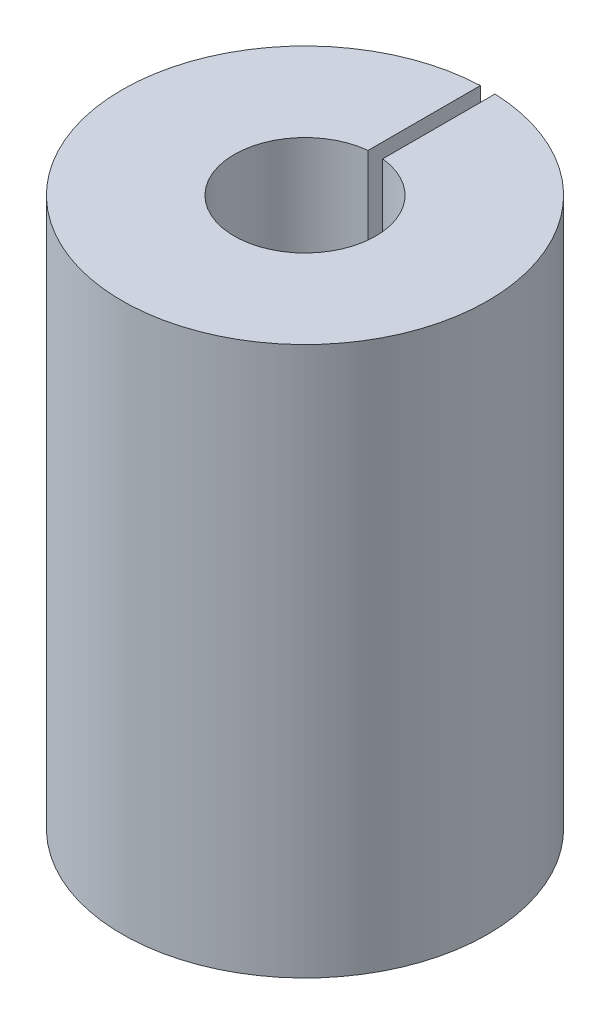
ISO-10303-21;
HEADER;
FILE_DESCRIPTION(('STEP AP214'),'2;1');
FILE_NAME('part.step','',(''),(''),'','','');
FILE_SCHEMA(('AUTOMOTIVE_DESIGN { 1 0 10303 214 1 1 1 1 }'));
ENDSEC;
DATA;
#1=APPLICATION_CONTEXT('core data for automotive mechanical design processes');
#2=APPLICATION_PROTOCOL_DEFINITION('international standard','automotive_design',2000,#1);
#3=PRODUCT_CONTEXT('',#1,'mechanical');
#4=PRODUCT('Part','Part','',(#3));
#5=PRODUCT_RELATED_PRODUCT_CATEGORY('part','',(#4));
#6=PRODUCT_DEFINITION_FORMATION('','',#4);
#7=PRODUCT_DEFINITION_CONTEXT('part definition',#1,'design');
#8=PRODUCT_DEFINITION('design','',#6,#7);
#9=PRODUCT_DEFINITION_SHAPE('','',#8);
#10=(LENGTH_UNIT() NAMED_UNIT(*) SI_UNIT(.MILLI.,.METRE.));
#11=(NAMED_UNIT(*) PLANE_ANGLE_UNIT() SI_UNIT($,.RADIAN.));
#12=(NAMED_UNIT(*) SI_UNIT($,.STERADIAN.) SOLID_ANGLE_UNIT());
#13=UNCERTAINTY_MEASURE_WITH_UNIT(LENGTH_MEASURE(1.E-05),#10,'distance_accuracy_value','');
#14=(GEOMETRIC_REPRESENTATION_CONTEXT(3) GLOBAL_UNCERTAINTY_ASSIGNED_CONTEXT((#13)) GLOBAL_UNIT_ASSIGNED_CONTEXT((#10,
#11,#12)) REPRESENTATION_CONTEXT('',''));
#15=CARTESIAN_POINT('',(0.,0.,0.));
#16=DIRECTION('',(0.,0.,1.));
#17=DIRECTION('',(1.,0.,0.));
#18=AXIS2_PLACEMENT_3D('',#15,#16,#17);
#19=CARTESIAN_POINT('',(-18.1755583274828,19.05,-4.23414735763339));
#20=DIRECTION('',(0.,-1.,0.));
#21=DIRECTION('',(0.,0.,-1.));
#22=AXIS2_PLACEMENT_3D('',#19,#20,#21);
#23=CYLINDRICAL_SURFACE('',#22,6.35);
#24=CARTESIAN_POINT('',(-18.1755583274828,19.05,-4.23414735763339));
#25=DIRECTION('',(0.,1.,0.));
#26=DIRECTION('',(0.,0.,1.));
#27=AXIS2_PLACEMENT_3D('',#24,#25,#26);
#28=CIRCLE('',#27,6.35);
#29=CARTESIAN_POINT('',(-18.4295583274828,19.05,-10.5790653240062));
#30=VERTEX_POINT('',#29);
#31=CARTESIAN_POINT('',(-17.9215583274828,19.05,-10.5790653240062));
#32=VERTEX_POINT('',#31);
#33=EDGE_CURVE('E11',#30,#32,#28,.T.);
#34=ORIENTED_EDGE('',*,*,#33,.F.);
#35=DIRECTION('',(0.,1.,0.));
#36=VECTOR('',#35,1.);
#37=CARTESIAN_POINT('',(-18.4295583274828,0.,-10.5790653240062));
#38=LINE('',#37,#36);
#39=CARTESIAN_POINT('',(-18.4295583274828,0.,-10.5790653240062));
#40=VERTEX_POINT('',#39);
#41=EDGE_CURVE('E82',#40,#30,#38,.T.);
#42=ORIENTED_EDGE('',*,*,#41,.F.);
#43=CARTESIAN_POINT('',(-18.1755583274828,0.,-4.23414735763339));
#44=DIRECTION('',(0.,1.,0.));
#45=DIRECTION('',(0.,0.,1.));
#46=AXIS2_PLACEMENT_3D('',#43,#44,#45);
#47=CIRCLE('',#46,6.35);
#48=CARTESIAN_POINT('',(-17.9215583274828,0.,-10.5790653240062));
#49=VERTEX_POINT('',#48);
#50=EDGE_CURVE('E40',#40,#49,#47,.T.);
#51=ORIENTED_EDGE('',*,*,#50,.T.);
#52=DIRECTION('',(0.,1.,0.));
#53=VECTOR('',#52,1.);
#54=CARTESIAN_POINT('',(-17.9215583274828,0.,-10.5790653240062));
#55=LINE('',#54,#53);
#56=EDGE_CURVE('E75',#49,#32,#55,.T.);
#57=ORIENTED_EDGE('',*,*,#56,.T.);
#58=EDGE_LOOP('',(#34,#42,#51,#57));
#59=FACE_BOUND('',#58,.T.);
#60=ADVANCED_FACE('F37',(#59),#23,.T.);
#61=CARTESIAN_POINT('',(-18.1755583274828,19.05,-4.23414735763339));
#62=DIRECTION('',(0.,1.,0.));
#63=DIRECTION('',(0.,0.,1.));
#64=AXIS2_PLACEMENT_3D('',#61,#62,#63);
#65=PLANE('',#64);
#66=DIRECTION('',(0.,0.,1.));
#67=VECTOR('',#66,1.);
#68=CARTESIAN_POINT('',(-18.4295583274828,19.05,-10.5790653240062));
#69=LINE('',#68,#67);
#70=CARTESIAN_POINT('',(-18.4295583274828,19.05,-6.67843549582413));
#71=VERTEX_POINT('',#70);
#72=EDGE_CURVE('E51',#30,#71,#69,.T.);
#73=ORIENTED_EDGE('',*,*,#72,.F.);
#74=ORIENTED_EDGE('',*,*,#33,.T.);
#75=DIRECTION('',(0.,0.,-1.));
#76=VECTOR('',#75,1.);
#77=CARTESIAN_POINT('',(-17.9215583274828,19.05,-10.5790653240062));
#78=LINE('',#77,#76);
#79=CARTESIAN_POINT('',(-17.9215583274828,19.05,-6.67843549582413));
#80=VERTEX_POINT('',#79);
#81=EDGE_CURVE('E78',#80,#32,#78,.T.);
#82=ORIENTED_EDGE('',*,*,#81,.F.);
#83=CARTESIAN_POINT('',(-18.1755583274828,19.05,-4.23414735763339));
#84=DIRECTION('',(0.,1.,0.));
#85=DIRECTION('',(0.,0.,1.));
#86=AXIS2_PLACEMENT_3D('',#83,#84,#85);
#87=CIRCLE('',#86,2.45744999999999);
#88=EDGE_CURVE('E95',#71,#80,#87,.T.);
#89=ORIENTED_EDGE('',*,*,#88,.F.);
#90=EDGE_LOOP('',(#73,#74,#82,#89));
#91=FACE_BOUND('',#90,.T.);
#92=ADVANCED_FACE('F110',(#91),#65,.T.);
#93=CARTESIAN_POINT('',(-18.1755583274828,0.,-4.23414735763339));
#94=DIRECTION('',(0.,1.,0.));
#95=DIRECTION('',(0.,0.,1.));
#96=AXIS2_PLACEMENT_3D('',#93,#94,#95);
#97=PLANE('',#96);
#98=ORIENTED_EDGE('',*,*,#50,.F.);
#99=DIRECTION('',(0.,0.,1.));
#100=VECTOR('',#99,1.);
#101=CARTESIAN_POINT('',(-18.4295583274828,0.,-10.5790653240062));
#102=LINE('',#101,#100);
#103=CARTESIAN_POINT('',(-18.4295583274828,0.,-6.67843549582413));
#104=VERTEX_POINT('',#103);
#105=EDGE_CURVE('E92',#40,#104,#102,.T.);
#106=ORIENTED_EDGE('',*,*,#105,.T.);
#107=CARTESIAN_POINT('',(-18.1755583274828,0.,-4.23414735763339));
#108=DIRECTION('',(0.,1.,0.));
#109=DIRECTION('',(0.,0.,1.));
#110=AXIS2_PLACEMENT_3D('',#107,#108,#109);
#111=CIRCLE('',#110,2.45745);
#112=CARTESIAN_POINT('',(-17.9215583274828,0.,-6.67843549582413));
#113=VERTEX_POINT('',#112);
#114=EDGE_CURVE('E91',#104,#113,#111,.T.);
#115=ORIENTED_EDGE('',*,*,#114,.T.);
#116=DIRECTION('',(0.,0.,-1.));
#117=VECTOR('',#116,1.);
#118=CARTESIAN_POINT('',(-17.9215583274828,0.,-10.5790653240062));
#119=LINE('',#118,#117);
#120=EDGE_CURVE('E59',#113,#49,#119,.T.);
#121=ORIENTED_EDGE('',*,*,#120,.T.);
#122=EDGE_LOOP('',(#98,#106,#115,#121));
#123=FACE_BOUND('',#122,.T.);
#124=ADVANCED_FACE('F88',(#123),#97,.F.);
#125=CARTESIAN_POINT('',(-18.1755583274828,19.05,-4.23414735763339));
#126=DIRECTION('',(0.,1.,0.));
#127=DIRECTION('',(0.,0.,1.));
#128=AXIS2_PLACEMENT_3D('',#125,#126,#127);
#129=CYLINDRICAL_SURFACE('',#128,2.45744999999999);
#130=ORIENTED_EDGE('',*,*,#114,.F.);
#131=DIRECTION('',(0.,1.,0.));
#132=VECTOR('',#131,1.);
#133=CARTESIAN_POINT('',(-18.4295583274828,0.,-6.67843549582413));
#134=LINE('',#133,#132);
#135=EDGE_CURVE('E98',#104,#71,#134,.T.);
#136=ORIENTED_EDGE('',*,*,#135,.T.);
#137=ORIENTED_EDGE('',*,*,#88,.T.);
#138=DIRECTION('',(0.,1.,0.));
#139=VECTOR('',#138,1.);
#140=CARTESIAN_POINT('',(-17.9215583274828,0.,-6.67843549582413));
#141=LINE('',#140,#139);
#142=EDGE_CURVE('E83',#113,#80,#141,.T.);
#143=ORIENTED_EDGE('',*,*,#142,.F.);
#144=EDGE_LOOP('',(#130,#136,#137,#143));
#145=FACE_BOUND('',#144,.T.);
#146=ADVANCED_FACE('F107',(#145),#129,.F.);
#147=CARTESIAN_POINT('',(-17.9215583274828,0.,-10.5790653240062));
#148=DIRECTION('',(1.,0.,0.));
#149=DIRECTION('',(0.,0.,-1.));
#150=AXIS2_PLACEMENT_3D('',#147,#148,#149);
#151=PLANE('',#150);
#152=ORIENTED_EDGE('',*,*,#81,.T.);
#153=ORIENTED_EDGE('',*,*,#56,.F.);
#154=ORIENTED_EDGE('',*,*,#120,.F.);
#155=ORIENTED_EDGE('',*,*,#142,.T.);
#156=EDGE_LOOP('',(#152,#153,#154,#155));
#157=FACE_BOUND('',#156,.T.);
#158=ADVANCED_FACE('F76',(#157),#151,.F.);
#159=CARTESIAN_POINT('',(-18.4295583274828,0.,-10.5790653240062));
#160=DIRECTION('',(-1.,0.,0.));
#161=DIRECTION('',(0.,0.,1.));
#162=AXIS2_PLACEMENT_3D('',#159,#160,#161);
#163=PLANE('',#162);
#164=ORIENTED_EDGE('',*,*,#72,.T.);
#165=ORIENTED_EDGE('',*,*,#135,.F.);
#166=ORIENTED_EDGE('',*,*,#105,.F.);
#167=ORIENTED_EDGE('',*,*,#41,.T.);
#168=EDGE_LOOP('',(#164,#165,#166,#167));
#169=FACE_BOUND('',#168,.T.);
#170=ADVANCED_FACE('F122',(#169),#163,.F.);
#171=CLOSED_SHELL('',(#60,#92,#124,#146,#158,#170));
#172=MANIFOLD_SOLID_BREP('B2',#171);
#173=ADVANCED_BREP_SHAPE_REPRESENTATION('',(#18,#172),#14);
#174=SHAPE_DEFINITION_REPRESENTATION(#9,#173);
ENDSEC;
END-ISO-10303-21;
